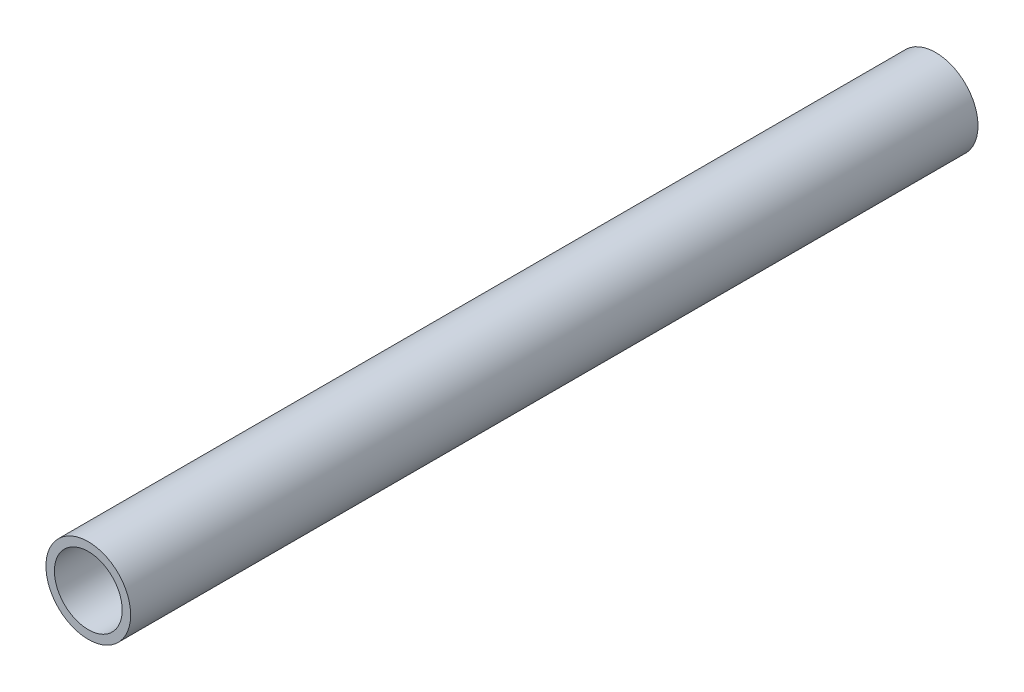
ISO-10303-21;
HEADER;
FILE_DESCRIPTION(('STEP AP214'),'2;1');
FILE_NAME('part.step','',(''),(''),'','','');
FILE_SCHEMA(('AUTOMOTIVE_DESIGN { 1 0 10303 214 1 1 1 1 }'));
ENDSEC;
DATA;
#1=APPLICATION_CONTEXT('core data for automotive mechanical design processes');
#2=APPLICATION_PROTOCOL_DEFINITION('international standard','automotive_design',2000,#1);
#3=PRODUCT_CONTEXT('',#1,'mechanical');
#4=PRODUCT('Part','Part','',(#3));
#5=PRODUCT_RELATED_PRODUCT_CATEGORY('part','',(#4));
#6=PRODUCT_DEFINITION_FORMATION('','',#4);
#7=PRODUCT_DEFINITION_CONTEXT('part definition',#1,'design');
#8=PRODUCT_DEFINITION('design','',#6,#7);
#9=PRODUCT_DEFINITION_SHAPE('','',#8);
#10=(LENGTH_UNIT() NAMED_UNIT(*) SI_UNIT(.MILLI.,.METRE.));
#11=(NAMED_UNIT(*) PLANE_ANGLE_UNIT() SI_UNIT($,.RADIAN.));
#12=(NAMED_UNIT(*) SI_UNIT($,.STERADIAN.) SOLID_ANGLE_UNIT());
#13=UNCERTAINTY_MEASURE_WITH_UNIT(LENGTH_MEASURE(1.E-05),#10,'distance_accuracy_value','');
#14=(GEOMETRIC_REPRESENTATION_CONTEXT(3) GLOBAL_UNCERTAINTY_ASSIGNED_CONTEXT((#13)) GLOBAL_UNIT_ASSIGNED_CONTEXT((#10,
#11,#12)) REPRESENTATION_CONTEXT('',''));
#15=CARTESIAN_POINT('',(0.,0.,0.));
#16=DIRECTION('',(0.,0.,1.));
#17=DIRECTION('',(1.,0.,0.));
#18=AXIS2_PLACEMENT_3D('',#15,#16,#17);
#19=CARTESIAN_POINT('',(0.,0.,500.));
#20=DIRECTION('',(0.,0.,1.));
#21=DIRECTION('',(1.,0.,0.));
#22=AXIS2_PLACEMENT_3D('',#19,#20,#21);
#23=PLANE('',#22);
#24=CARTESIAN_POINT('',(0.,0.,500.));
#25=DIRECTION('',(0.,0.,1.));
#26=DIRECTION('',(1.,0.,0.));
#27=AXIS2_PLACEMENT_3D('',#24,#25,#26);
#28=CIRCLE('',#27,25.);
#29=CARTESIAN_POINT('',(25.,0.,500.));
#30=VERTEX_POINT('',#29);
#31=EDGE_CURVE('E10',#30,#30,#28,.T.);
#32=ORIENTED_EDGE('',*,*,#31,.T.);
#33=EDGE_LOOP('',(#32));
#34=FACE_BOUND('',#33,.T.);
#35=CARTESIAN_POINT('',(0.,0.,500.));
#36=DIRECTION('',(0.,0.,1.));
#37=DIRECTION('',(1.,0.,0.));
#38=AXIS2_PLACEMENT_3D('',#35,#36,#37);
#39=CIRCLE('',#38,20.);
#40=CARTESIAN_POINT('',(20.,0.,500.));
#41=VERTEX_POINT('',#40);
#42=EDGE_CURVE('E42',#41,#41,#39,.T.);
#43=ORIENTED_EDGE('',*,*,#42,.F.);
#44=EDGE_LOOP('',(#43));
#45=FACE_BOUND('',#44,.T.);
#46=ADVANCED_FACE('F31',(#34,#45),#23,.T.);
#47=CARTESIAN_POINT('',(0.,0.,0.));
#48=DIRECTION('',(0.,0.,1.));
#49=DIRECTION('',(1.,0.,0.));
#50=AXIS2_PLACEMENT_3D('',#47,#48,#49);
#51=PLANE('',#50);
#52=CARTESIAN_POINT('',(0.,0.,0.));
#53=DIRECTION('',(0.,0.,1.));
#54=DIRECTION('',(1.,0.,0.));
#55=AXIS2_PLACEMENT_3D('',#52,#53,#54);
#56=CIRCLE('',#55,25.);
#57=CARTESIAN_POINT('',(25.,0.,0.));
#58=VERTEX_POINT('',#57);
#59=EDGE_CURVE('E35',#58,#58,#56,.T.);
#60=ORIENTED_EDGE('',*,*,#59,.F.);
#61=EDGE_LOOP('',(#60));
#62=FACE_BOUND('',#61,.T.);
#63=CARTESIAN_POINT('',(0.,0.,0.));
#64=DIRECTION('',(0.,0.,1.));
#65=DIRECTION('',(1.,0.,0.));
#66=AXIS2_PLACEMENT_3D('',#63,#64,#65);
#67=CIRCLE('',#66,20.);
#68=CARTESIAN_POINT('',(20.,0.,0.));
#69=VERTEX_POINT('',#68);
#70=EDGE_CURVE('E44',#69,#69,#67,.T.);
#71=ORIENTED_EDGE('',*,*,#70,.T.);
#72=EDGE_LOOP('',(#71));
#73=FACE_BOUND('',#72,.T.);
#74=ADVANCED_FACE('F54',(#62,#73),#51,.F.);
#75=CARTESIAN_POINT('',(0.,0.,500.));
#76=DIRECTION('',(0.,0.,-1.));
#77=DIRECTION('',(-1.,0.,0.));
#78=AXIS2_PLACEMENT_3D('',#75,#76,#77);
#79=CYLINDRICAL_SURFACE('',#78,25.);
#80=ORIENTED_EDGE('',*,*,#31,.F.);
#81=EDGE_LOOP('',(#80));
#82=FACE_BOUND('',#81,.T.);
#83=ORIENTED_EDGE('',*,*,#59,.T.);
#84=EDGE_LOOP('',(#83));
#85=FACE_BOUND('',#84,.T.);
#86=ADVANCED_FACE('F33',(#82,#85),#79,.T.);
#87=CARTESIAN_POINT('',(0.,0.,500.));
#88=DIRECTION('',(0.,0.,-1.));
#89=DIRECTION('',(-1.,0.,0.));
#90=AXIS2_PLACEMENT_3D('',#87,#88,#89);
#91=CYLINDRICAL_SURFACE('',#90,20.);
#92=ORIENTED_EDGE('',*,*,#42,.T.);
#93=EDGE_LOOP('',(#92));
#94=FACE_BOUND('',#93,.T.);
#95=ORIENTED_EDGE('',*,*,#70,.F.);
#96=EDGE_LOOP('',(#95));
#97=FACE_BOUND('',#96,.T.);
#98=ADVANCED_FACE('F50',(#94,#97),#91,.F.);
#99=CLOSED_SHELL('',(#46,#74,#86,#98));
#100=MANIFOLD_SOLID_BREP('B2',#99);
#101=ADVANCED_BREP_SHAPE_REPRESENTATION('',(#18,#100),#14);
#102=SHAPE_DEFINITION_REPRESENTATION(#9,#101);
ENDSEC;
END-ISO-10303-21;
